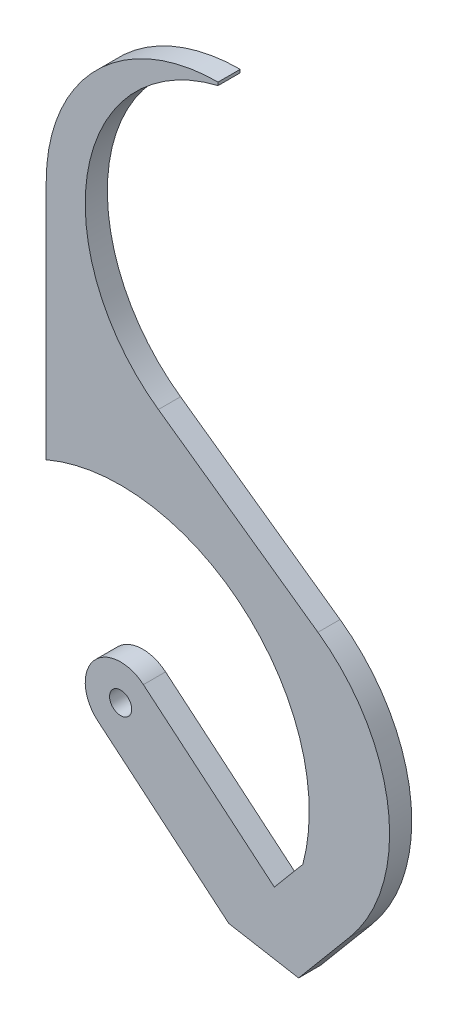
ISO-10303-21;
HEADER;
FILE_DESCRIPTION(('STEP AP214'),'2;1');
FILE_NAME('part.step','',(''),(''),'','','');
FILE_SCHEMA(('AUTOMOTIVE_DESIGN { 1 0 10303 214 1 1 1 1 }'));
ENDSEC;
DATA;
#1=APPLICATION_CONTEXT('core data for automotive mechanical design processes');
#2=APPLICATION_PROTOCOL_DEFINITION('international standard','automotive_design',2000,#1);
#3=PRODUCT_CONTEXT('',#1,'mechanical');
#4=PRODUCT('Part','Part','',(#3));
#5=PRODUCT_RELATED_PRODUCT_CATEGORY('part','',(#4));
#6=PRODUCT_DEFINITION_FORMATION('','',#4);
#7=PRODUCT_DEFINITION_CONTEXT('part definition',#1,'design');
#8=PRODUCT_DEFINITION('design','',#6,#7);
#9=PRODUCT_DEFINITION_SHAPE('','',#8);
#10=(LENGTH_UNIT() NAMED_UNIT(*) SI_UNIT(.MILLI.,.METRE.));
#11=(NAMED_UNIT(*) PLANE_ANGLE_UNIT() SI_UNIT($,.RADIAN.));
#12=(NAMED_UNIT(*) SI_UNIT($,.STERADIAN.) SOLID_ANGLE_UNIT());
#13=UNCERTAINTY_MEASURE_WITH_UNIT(LENGTH_MEASURE(1.E-05),#10,'distance_accuracy_value','');
#14=(GEOMETRIC_REPRESENTATION_CONTEXT(3) GLOBAL_UNCERTAINTY_ASSIGNED_CONTEXT((#13)) GLOBAL_UNIT_ASSIGNED_CONTEXT((#10,
#11,#12)) REPRESENTATION_CONTEXT('',''));
#15=CARTESIAN_POINT('',(0.,0.,0.));
#16=DIRECTION('',(0.,0.,1.));
#17=DIRECTION('',(1.,0.,0.));
#18=AXIS2_PLACEMENT_3D('',#15,#16,#17);
#19=CARTESIAN_POINT('',(-83.82,-84.8367141014244,-454.025));
#20=DIRECTION('',(0.,0.,1.));
#21=DIRECTION('',(1.,0.,0.));
#22=AXIS2_PLACEMENT_3D('',#19,#20,#21);
#23=CYLINDRICAL_SURFACE('',#22,5.07999999999999);
#24=CARTESIAN_POINT('',(-83.82,-84.8367141014244,-450.85));
#25=DIRECTION('',(0.,0.,1.));
#26=DIRECTION('',(1.,0.,0.));
#27=AXIS2_PLACEMENT_3D('',#24,#25,#26);
#28=CIRCLE('',#27,5.07999999999999);
#29=CARTESIAN_POINT('',(-80.5546389427924,-80.94520833038,-450.85));
#30=VERTEX_POINT('',#29);
#31=CARTESIAN_POINT('',(-87.0853610572076,-88.7282198724688,-450.85));
#32=VERTEX_POINT('',#31);
#33=EDGE_CURVE('E159',#30,#32,#28,.T.);
#34=ORIENTED_EDGE('',*,*,#33,.F.);
#35=DIRECTION('',(0.,0.,1.));
#36=VECTOR('',#35,1.);
#37=CARTESIAN_POINT('',(-80.5546389427924,-80.94520833038,-454.025));
#38=LINE('',#37,#36);
#39=CARTESIAN_POINT('',(-80.5546389427924,-80.94520833038,-454.025));
#40=VERTEX_POINT('',#39);
#41=EDGE_CURVE('E11',#40,#30,#38,.T.);
#42=ORIENTED_EDGE('',*,*,#41,.F.);
#43=CARTESIAN_POINT('',(-83.82,-84.8367141014244,-454.025));
#44=DIRECTION('',(0.,0.,1.));
#45=DIRECTION('',(1.,0.,0.));
#46=AXIS2_PLACEMENT_3D('',#43,#44,#45);
#47=CIRCLE('',#46,5.07999999999999);
#48=CARTESIAN_POINT('',(-87.0853610572076,-88.7282198724688,-454.025));
#49=VERTEX_POINT('',#48);
#50=EDGE_CURVE('E195',#40,#49,#47,.T.);
#51=ORIENTED_EDGE('',*,*,#50,.T.);
#52=DIRECTION('',(0.,0.,1.));
#53=VECTOR('',#52,1.);
#54=CARTESIAN_POINT('',(-87.0853610572076,-88.7282198724688,-454.025));
#55=LINE('',#54,#53);
#56=EDGE_CURVE('E35',#49,#32,#55,.T.);
#57=ORIENTED_EDGE('',*,*,#56,.T.);
#58=EDGE_LOOP('',(#34,#42,#51,#57));
#59=FACE_BOUND('',#58,.T.);
#60=ADVANCED_FACE('F32',(#59),#23,.T.);
#61=CARTESIAN_POINT('',(-61.777576564075,-96.7010344469544,-454.025));
#62=DIRECTION('',(0.642787609686537,0.76604444311898,0.));
#63=DIRECTION('',(-0.76604444311898,0.642787609686537,0.));
#64=AXIS2_PLACEMENT_3D('',#61,#62,#63);
#65=PLANE('',#64);
#66=DIRECTION('',(-0.76604444311898,0.642787609686537,0.));
#67=VECTOR('',#66,1.);
#68=CARTESIAN_POINT('',(-61.777576564075,-96.7010344469544,-450.85));
#69=LINE('',#68,#67);
#70=CARTESIAN_POINT('',(-61.777576564075,-96.7010344469544,-450.85));
#71=VERTEX_POINT('',#70);
#72=EDGE_CURVE('E193',#71,#30,#69,.T.);
#73=ORIENTED_EDGE('',*,*,#72,.F.);
#74=DIRECTION('',(0.,0.,1.));
#75=VECTOR('',#74,1.);
#76=CARTESIAN_POINT('',(-61.777576564075,-96.7010344469544,-454.025));
#77=LINE('',#76,#75);
#78=CARTESIAN_POINT('',(-61.777576564075,-96.7010344469544,-454.025));
#79=VERTEX_POINT('',#78);
#80=EDGE_CURVE('E41',#79,#71,#77,.T.);
#81=ORIENTED_EDGE('',*,*,#80,.F.);
#82=DIRECTION('',(-0.76604444311898,0.642787609686537,0.));
#83=VECTOR('',#82,1.);
#84=CARTESIAN_POINT('',(-61.777576564075,-96.7010344469544,-454.025));
#85=LINE('',#84,#83);
#86=EDGE_CURVE('E149',#79,#40,#85,.T.);
#87=ORIENTED_EDGE('',*,*,#86,.T.);
#88=ORIENTED_EDGE('',*,*,#41,.T.);
#89=EDGE_LOOP('',(#73,#81,#87,#88));
#90=FACE_BOUND('',#89,.T.);
#91=ADVANCED_FACE('F217',(#90),#65,.T.);
#92=CARTESIAN_POINT('',(-61.777576564075,-96.7010344469544,-454.025));
#93=DIRECTION('',(-0.76604444311898,0.642787609686537,0.));
#94=DIRECTION('',(-0.642787609686537,-0.76604444311898,0.));
#95=AXIS2_PLACEMENT_3D('',#92,#93,#94);
#96=PLANE('',#95);
#97=DIRECTION('',(-0.642787609686537,-0.76604444311898,0.));
#98=VECTOR('',#97,1.);
#99=CARTESIAN_POINT('',(-61.777576564075,-96.7010344469544,-450.85));
#100=LINE('',#99,#98);
#101=CARTESIAN_POINT('',(-57.6958752425654,-91.8366522331489,-450.85));
#102=VERTEX_POINT('',#101);
#103=EDGE_CURVE('E136',#102,#71,#100,.T.);
#104=ORIENTED_EDGE('',*,*,#103,.F.);
#105=DIRECTION('',(0.,0.,1.));
#106=VECTOR('',#105,1.);
#107=CARTESIAN_POINT('',(-57.6958752425654,-91.8366522331489,-454.025));
#108=LINE('',#107,#106);
#109=CARTESIAN_POINT('',(-57.6958752425654,-91.8366522331489,-454.025));
#110=VERTEX_POINT('',#109);
#111=EDGE_CURVE('E131',#110,#102,#108,.T.);
#112=ORIENTED_EDGE('',*,*,#111,.F.);
#113=DIRECTION('',(-0.642787609686537,-0.76604444311898,0.));
#114=VECTOR('',#113,1.);
#115=CARTESIAN_POINT('',(-61.777576564075,-96.7010344469544,-454.025));
#116=LINE('',#115,#114);
#117=EDGE_CURVE('E134',#110,#79,#116,.T.);
#118=ORIENTED_EDGE('',*,*,#117,.T.);
#119=ORIENTED_EDGE('',*,*,#80,.T.);
#120=EDGE_LOOP('',(#104,#112,#118,#119));
#121=FACE_BOUND('',#120,.T.);
#122=ADVANCED_FACE('F133',(#121),#96,.T.);
#123=CARTESIAN_POINT('',(-83.82,-84.8367141014244,-454.025));
#124=DIRECTION('',(0.,0.,1.));
#125=DIRECTION('',(1.,0.,0.));
#126=AXIS2_PLACEMENT_3D('',#123,#124,#125);
#127=CYLINDRICAL_SURFACE('',#126,27.0456840954333);
#128=CARTESIAN_POINT('',(-83.82,-84.8367141014244,-450.85));
#129=DIRECTION('',(0.,0.,-1.));
#130=DIRECTION('',(1.,0.,0.));
#131=AXIS2_PLACEMENT_3D('',#128,#129,#130);
#132=CIRCLE('',#131,27.0456840954333);
#133=CARTESIAN_POINT('',(-94.4880000000001,-59.9838912398263,-450.85));
#134=VERTEX_POINT('',#133);
#135=EDGE_CURVE('E190',#134,#102,#132,.T.);
#136=ORIENTED_EDGE('',*,*,#135,.F.);
#137=DIRECTION('',(0.,0.,1.));
#138=VECTOR('',#137,1.);
#139=CARTESIAN_POINT('',(-94.4880000000001,-59.9838912398263,-454.025));
#140=LINE('',#139,#138);
#141=CARTESIAN_POINT('',(-94.4880000000001,-59.9838912398263,-454.025));
#142=VERTEX_POINT('',#141);
#143=EDGE_CURVE('E141',#142,#134,#140,.T.);
#144=ORIENTED_EDGE('',*,*,#143,.F.);
#145=CARTESIAN_POINT('',(-83.82,-84.8367141014244,-454.025));
#146=DIRECTION('',(0.,0.,-1.));
#147=DIRECTION('',(1.,0.,0.));
#148=AXIS2_PLACEMENT_3D('',#145,#146,#147);
#149=CIRCLE('',#148,27.0456840954333);
#150=EDGE_CURVE('E147',#142,#110,#149,.T.);
#151=ORIENTED_EDGE('',*,*,#150,.T.);
#152=ORIENTED_EDGE('',*,*,#111,.T.);
#153=EDGE_LOOP('',(#136,#144,#151,#152));
#154=FACE_BOUND('',#153,.T.);
#155=ADVANCED_FACE('F151',(#154),#127,.F.);
#156=CARTESIAN_POINT('',(-94.488,-25.4,-454.025));
#157=DIRECTION('',(-1.,0.,0.));
#158=DIRECTION('',(0.,-1.,0.));
#159=AXIS2_PLACEMENT_3D('',#156,#157,#158);
#160=PLANE('',#159);
#161=DIRECTION('',(0.,-1.,0.));
#162=VECTOR('',#161,1.);
#163=CARTESIAN_POINT('',(-94.488,-25.4,-450.85));
#164=LINE('',#163,#162);
#165=CARTESIAN_POINT('',(-94.488,-25.4,-450.85));
#166=VERTEX_POINT('',#165);
#167=EDGE_CURVE('E187',#166,#134,#164,.T.);
#168=ORIENTED_EDGE('',*,*,#167,.F.);
#169=DIRECTION('',(0.,0.,1.));
#170=VECTOR('',#169,1.);
#171=CARTESIAN_POINT('',(-94.488,-25.4,-454.025));
#172=LINE('',#171,#170);
#173=CARTESIAN_POINT('',(-94.488,-25.4,-454.025));
#174=VERTEX_POINT('',#173);
#175=EDGE_CURVE('E199',#174,#166,#172,.T.);
#176=ORIENTED_EDGE('',*,*,#175,.F.);
#177=DIRECTION('',(0.,-1.,0.));
#178=VECTOR('',#177,1.);
#179=CARTESIAN_POINT('',(-94.488,-25.4,-454.025));
#180=LINE('',#179,#178);
#181=EDGE_CURVE('E152',#174,#142,#180,.T.);
#182=ORIENTED_EDGE('',*,*,#181,.T.);
#183=ORIENTED_EDGE('',*,*,#143,.T.);
#184=EDGE_LOOP('',(#168,#176,#182,#183));
#185=FACE_BOUND('',#184,.T.);
#186=ADVANCED_FACE('F230',(#185),#160,.T.);
#187=CARTESIAN_POINT('',(-69.85,-25.4,-454.025));
#188=DIRECTION('',(0.,0.,1.));
#189=DIRECTION('',(1.,0.,0.));
#190=AXIS2_PLACEMENT_3D('',#187,#188,#189);
#191=CYLINDRICAL_SURFACE('',#190,24.638);
#192=CARTESIAN_POINT('',(-69.85,-25.4,-450.85));
#193=DIRECTION('',(0.,0.,1.));
#194=DIRECTION('',(1.,0.,0.));
#195=AXIS2_PLACEMENT_3D('',#192,#193,#194);
#196=CIRCLE('',#195,24.638);
#197=CARTESIAN_POINT('',(-69.85,-0.761999999999992,-450.85));
#198=VERTEX_POINT('',#197);
#199=EDGE_CURVE('E184',#198,#166,#196,.T.);
#200=ORIENTED_EDGE('',*,*,#199,.F.);
#201=DIRECTION('',(0.,0.,1.));
#202=VECTOR('',#201,1.);
#203=CARTESIAN_POINT('',(-69.85,-0.761999999999992,-454.025));
#204=LINE('',#203,#202);
#205=CARTESIAN_POINT('',(-69.85,-0.761999999999992,-454.025));
#206=VERTEX_POINT('',#205);
#207=EDGE_CURVE('E201',#206,#198,#204,.T.);
#208=ORIENTED_EDGE('',*,*,#207,.F.);
#209=CARTESIAN_POINT('',(-69.85,-25.4,-454.025));
#210=DIRECTION('',(0.,0.,1.));
#211=DIRECTION('',(1.,0.,0.));
#212=AXIS2_PLACEMENT_3D('',#209,#210,#211);
#213=CIRCLE('',#212,24.638);
#214=EDGE_CURVE('E154',#206,#174,#213,.T.);
#215=ORIENTED_EDGE('',*,*,#214,.T.);
#216=ORIENTED_EDGE('',*,*,#175,.T.);
#217=EDGE_LOOP('',(#200,#208,#215,#216));
#218=FACE_BOUND('',#217,.T.);
#219=ADVANCED_FACE('F233',(#218),#191,.T.);
#220=CARTESIAN_POINT('',(-69.85,-0.761999999999992,-454.025));
#221=DIRECTION('',(1.,0.,0.));
#222=DIRECTION('',(0.,0.,-1.));
#223=AXIS2_PLACEMENT_3D('',#220,#221,#222);
#224=PLANE('',#223);
#225=DIRECTION('',(0.,1.,0.));
#226=VECTOR('',#225,1.);
#227=CARTESIAN_POINT('',(-69.85,-0.761999999999992,-450.85));
#228=LINE('',#227,#226);
#229=CARTESIAN_POINT('',(-69.85,-1.20325021826278,-450.85));
#230=VERTEX_POINT('',#229);
#231=EDGE_CURVE('E181',#230,#198,#228,.T.);
#232=ORIENTED_EDGE('',*,*,#231,.F.);
#233=DIRECTION('',(0.,0.,1.));
#234=VECTOR('',#233,1.);
#235=CARTESIAN_POINT('',(-69.85,-1.20325021826278,-454.025));
#236=LINE('',#235,#234);
#237=CARTESIAN_POINT('',(-69.85,-1.20325021826278,-454.025));
#238=VERTEX_POINT('',#237);
#239=EDGE_CURVE('E203',#238,#230,#236,.T.);
#240=ORIENTED_EDGE('',*,*,#239,.F.);
#241=DIRECTION('',(0.,1.,0.));
#242=VECTOR('',#241,1.);
#243=CARTESIAN_POINT('',(-69.85,-0.761999999999992,-454.025));
#244=LINE('',#243,#242);
#245=EDGE_CURVE('E303',#238,#206,#244,.T.);
#246=ORIENTED_EDGE('',*,*,#245,.T.);
#247=ORIENTED_EDGE('',*,*,#207,.T.);
#248=EDGE_LOOP('',(#232,#240,#246,#247));
#249=FACE_BOUND('',#248,.T.);
#250=ADVANCED_FACE('F237',(#249),#224,.T.);
#251=CARTESIAN_POINT('',(-64.008,-25.4,-454.025));
#252=DIRECTION('',(0.,0.,1.));
#253=DIRECTION('',(1.,0.,0.));
#254=AXIS2_PLACEMENT_3D('',#251,#252,#253);
#255=CYLINDRICAL_SURFACE('',#254,24.892);
#256=CARTESIAN_POINT('',(-64.008,-25.4,-450.85));
#257=DIRECTION('',(0.,0.,-1.));
#258=DIRECTION('',(1.,0.,0.));
#259=AXIS2_PLACEMENT_3D('',#256,#257,#258);
#260=CIRCLE('',#259,24.892);
#261=CARTESIAN_POINT('',(-78.4071863115042,-45.7045585415342,-450.85));
#262=VERTEX_POINT('',#261);
#263=EDGE_CURVE('E178',#262,#230,#260,.T.);
#264=ORIENTED_EDGE('',*,*,#263,.F.);
#265=DIRECTION('',(0.,0.,1.));
#266=VECTOR('',#265,1.);
#267=CARTESIAN_POINT('',(-78.4071863115042,-45.7045585415342,-454.025));
#268=LINE('',#267,#266);
#269=CARTESIAN_POINT('',(-78.4071863115042,-45.7045585415342,-454.025));
#270=VERTEX_POINT('',#269);
#271=EDGE_CURVE('E205',#270,#262,#268,.T.);
#272=ORIENTED_EDGE('',*,*,#271,.F.);
#273=CARTESIAN_POINT('',(-64.008,-25.4,-454.025));
#274=DIRECTION('',(0.,0.,-1.));
#275=DIRECTION('',(1.,0.,0.));
#276=AXIS2_PLACEMENT_3D('',#273,#274,#275);
#277=CIRCLE('',#276,24.892);
#278=EDGE_CURVE('E300',#270,#238,#277,.T.);
#279=ORIENTED_EDGE('',*,*,#278,.T.);
#280=ORIENTED_EDGE('',*,*,#239,.T.);
#281=EDGE_LOOP('',(#264,#272,#279,#280));
#282=FACE_BOUND('',#281,.T.);
#283=ADVANCED_FACE('F241',(#282),#255,.F.);
#284=CARTESIAN_POINT('',(-78.4071863115042,-45.7045585415342,-454.025));
#285=DIRECTION('',(0.578466427426649,0.815706192412592,0.));
#286=DIRECTION('',(-0.815706192412592,0.578466427426649,0.));
#287=AXIS2_PLACEMENT_3D('',#284,#285,#286);
#288=PLANE('',#287);
#289=DIRECTION('',(-0.815706192412592,0.578466427426649,0.));
#290=VECTOR('',#289,1.);
#291=CARTESIAN_POINT('',(-78.4071863115042,-45.7045585415342,-450.85));
#292=LINE('',#291,#290);
#293=CARTESIAN_POINT('',(-55.5294918638108,-61.9285106189041,-450.85));
#294=VERTEX_POINT('',#293);
#295=EDGE_CURVE('E175',#294,#262,#292,.T.);
#296=ORIENTED_EDGE('',*,*,#295,.F.);
#297=DIRECTION('',(0.,0.,1.));
#298=VECTOR('',#297,1.);
#299=CARTESIAN_POINT('',(-55.5294918638108,-61.9285106189041,-454.025));
#300=LINE('',#299,#298);
#301=CARTESIAN_POINT('',(-55.5294918638108,-61.9285106189041,-454.025));
#302=VERTEX_POINT('',#301);
#303=EDGE_CURVE('E207',#302,#294,#300,.T.);
#304=ORIENTED_EDGE('',*,*,#303,.F.);
#305=DIRECTION('',(-0.815706192412592,0.578466427426649,0.));
#306=VECTOR('',#305,1.);
#307=CARTESIAN_POINT('',(-78.4071863115042,-45.7045585415342,-454.025));
#308=LINE('',#307,#306);
#309=EDGE_CURVE('E297',#302,#270,#308,.T.);
#310=ORIENTED_EDGE('',*,*,#309,.T.);
#311=ORIENTED_EDGE('',*,*,#271,.T.);
#312=EDGE_LOOP('',(#296,#304,#310,#311));
#313=FACE_BOUND('',#312,.T.);
#314=ADVANCED_FACE('F245',(#313),#288,.T.);
#315=CARTESIAN_POINT('',(-69.6348172301822,-81.8186904146927,-454.025));
#316=DIRECTION('',(0.,0.,1.));
#317=DIRECTION('',(1.,0.,0.));
#318=AXIS2_PLACEMENT_3D('',#315,#316,#317);
#319=CYLINDRICAL_SURFACE('',#318,24.384);
#320=CARTESIAN_POINT('',(-69.6348172301822,-81.8186904146927,-450.85));
#321=DIRECTION('',(0.,0.,1.));
#322=DIRECTION('',(1.,0.,0.));
#323=AXIS2_PLACEMENT_3D('',#320,#321,#322);
#324=CIRCLE('',#323,24.384);
#325=CARTESIAN_POINT('',(-50.955589529169,-97.4924234892892,-450.85));
#326=VERTEX_POINT('',#325);
#327=EDGE_CURVE('E172',#326,#294,#324,.T.);
#328=ORIENTED_EDGE('',*,*,#327,.F.);
#329=DIRECTION('',(0.,0.,1.));
#330=VECTOR('',#329,1.);
#331=CARTESIAN_POINT('',(-50.955589529169,-97.4924234892892,-454.025));
#332=LINE('',#331,#330);
#333=CARTESIAN_POINT('',(-50.955589529169,-97.4924234892892,-454.025));
#334=VERTEX_POINT('',#333);
#335=EDGE_CURVE('E209',#334,#326,#332,.T.);
#336=ORIENTED_EDGE('',*,*,#335,.F.);
#337=CARTESIAN_POINT('',(-69.6348172301822,-81.8186904146927,-454.025));
#338=DIRECTION('',(0.,0.,1.));
#339=DIRECTION('',(1.,0.,0.));
#340=AXIS2_PLACEMENT_3D('',#337,#338,#339);
#341=CIRCLE('',#340,24.384);
#342=EDGE_CURVE('E294',#334,#302,#341,.T.);
#343=ORIENTED_EDGE('',*,*,#342,.T.);
#344=ORIENTED_EDGE('',*,*,#303,.T.);
#345=EDGE_LOOP('',(#328,#336,#343,#344));
#346=FACE_BOUND('',#345,.T.);
#347=ADVANCED_FACE('F249',(#346),#319,.T.);
#348=CARTESIAN_POINT('',(-58.3026519078861,-106.248311474139,-454.025));
#349=DIRECTION('',(0.76604444311898,-0.642787609686537,0.));
#350=DIRECTION('',(0.642787609686537,0.76604444311898,0.));
#351=AXIS2_PLACEMENT_3D('',#348,#349,#350);
#352=PLANE('',#351);
#353=DIRECTION('',(0.642787609686537,0.76604444311898,0.));
#354=VECTOR('',#353,1.);
#355=CARTESIAN_POINT('',(-58.3026519078861,-106.248311474139,-450.85));
#356=LINE('',#355,#354);
#357=CARTESIAN_POINT('',(-58.3026519078861,-106.248311474139,-450.85));
#358=VERTEX_POINT('',#357);
#359=EDGE_CURVE('E169',#358,#326,#356,.T.);
#360=ORIENTED_EDGE('',*,*,#359,.F.);
#361=DIRECTION('',(0.,0.,1.));
#362=VECTOR('',#361,1.);
#363=CARTESIAN_POINT('',(-58.3026519078861,-106.248311474139,-454.025));
#364=LINE('',#363,#362);
#365=CARTESIAN_POINT('',(-58.3026519078861,-106.248311474139,-454.025));
#366=VERTEX_POINT('',#365);
#367=EDGE_CURVE('E211',#366,#358,#364,.T.);
#368=ORIENTED_EDGE('',*,*,#367,.F.);
#369=DIRECTION('',(0.642787609686537,0.76604444311898,0.));
#370=VECTOR('',#369,1.);
#371=CARTESIAN_POINT('',(-58.3026519078861,-106.248311474139,-454.025));
#372=LINE('',#371,#370);
#373=EDGE_CURVE('E291',#366,#334,#372,.T.);
#374=ORIENTED_EDGE('',*,*,#373,.T.);
#375=ORIENTED_EDGE('',*,*,#335,.T.);
#376=EDGE_LOOP('',(#360,#368,#374,#375));
#377=FACE_BOUND('',#376,.T.);
#378=ADVANCED_FACE('F253',(#377),#352,.T.);
#379=CARTESIAN_POINT('',(-68.3082986784902,-104.484045989043,-454.025));
#380=DIRECTION('',(-0.173648177666923,-0.984807753012209,0.));
#381=DIRECTION('',(0.984807753012209,-0.173648177666923,0.));
#382=AXIS2_PLACEMENT_3D('',#379,#380,#381);
#383=PLANE('',#382);
#384=DIRECTION('',(0.984807753012209,-0.173648177666923,0.));
#385=VECTOR('',#384,1.);
#386=CARTESIAN_POINT('',(-68.3082986784902,-104.484045989043,-450.85));
#387=LINE('',#386,#385);
#388=CARTESIAN_POINT('',(-68.3082986784902,-104.484045989043,-450.85));
#389=VERTEX_POINT('',#388);
#390=EDGE_CURVE('E166',#389,#358,#387,.T.);
#391=ORIENTED_EDGE('',*,*,#390,.F.);
#392=DIRECTION('',(0.,0.,1.));
#393=VECTOR('',#392,1.);
#394=CARTESIAN_POINT('',(-68.3082986784902,-104.484045989043,-454.025));
#395=LINE('',#394,#393);
#396=CARTESIAN_POINT('',(-68.3082986784902,-104.484045989043,-454.025));
#397=VERTEX_POINT('',#396);
#398=EDGE_CURVE('E212',#397,#389,#395,.T.);
#399=ORIENTED_EDGE('',*,*,#398,.F.);
#400=DIRECTION('',(0.984807753012209,-0.173648177666923,0.));
#401=VECTOR('',#400,1.);
#402=CARTESIAN_POINT('',(-68.3082986784902,-104.484045989043,-454.025));
#403=LINE('',#402,#401);
#404=EDGE_CURVE('E288',#397,#366,#403,.T.);
#405=ORIENTED_EDGE('',*,*,#404,.T.);
#406=ORIENTED_EDGE('',*,*,#367,.T.);
#407=EDGE_LOOP('',(#391,#399,#405,#406));
#408=FACE_BOUND('',#407,.T.);
#409=ADVANCED_FACE('F257',(#408),#383,.T.);
#410=CARTESIAN_POINT('',(-87.0853610572076,-88.7282198724688,-454.025));
#411=DIRECTION('',(-0.642787609686537,-0.766044443118979,0.));
#412=DIRECTION('',(0.76604444311898,-0.642787609686538,0.));
#413=AXIS2_PLACEMENT_3D('',#410,#411,#412);
#414=PLANE('',#413);
#415=DIRECTION('',(0.76604444311898,-0.642787609686537,0.));
#416=VECTOR('',#415,1.);
#417=CARTESIAN_POINT('',(-87.0853610572076,-88.7282198724688,-450.85));
#418=LINE('',#417,#416);
#419=EDGE_CURVE('E162',#32,#389,#418,.T.);
#420=ORIENTED_EDGE('',*,*,#419,.F.);
#421=ORIENTED_EDGE('',*,*,#56,.F.);
#422=DIRECTION('',(0.76604444311898,-0.642787609686537,0.));
#423=VECTOR('',#422,1.);
#424=CARTESIAN_POINT('',(-87.0853610572076,-88.7282198724688,-454.025));
#425=LINE('',#424,#423);
#426=EDGE_CURVE('E286',#49,#397,#425,.T.);
#427=ORIENTED_EDGE('',*,*,#426,.T.);
#428=ORIENTED_EDGE('',*,*,#398,.T.);
#429=EDGE_LOOP('',(#420,#421,#427,#428));
#430=FACE_BOUND('',#429,.T.);
#431=ADVANCED_FACE('F214',(#430),#414,.T.);
#432=CARTESIAN_POINT('',(-83.82,-84.8367141014244,-454.025));
#433=DIRECTION('',(0.,0.,1.));
#434=DIRECTION('',(1.,0.,0.));
#435=AXIS2_PLACEMENT_3D('',#432,#433,#434);
#436=PLANE('',#435);
#437=CARTESIAN_POINT('',(-83.82,-84.8367141014244,-454.025));
#438=DIRECTION('',(0.,0.,1.));
#439=DIRECTION('',(1.,0.,0.));
#440=AXIS2_PLACEMENT_3D('',#437,#438,#439);
#441=CIRCLE('',#440,1.58749999999999);
#442=CARTESIAN_POINT('',(-82.2325,-84.8367141014244,-454.025));
#443=VERTEX_POINT('',#442);
#444=EDGE_CURVE('E163',#443,#443,#441,.T.);
#445=ORIENTED_EDGE('',*,*,#444,.T.);
#446=EDGE_LOOP('',(#445));
#447=FACE_BOUND('',#446,.T.);
#448=ORIENTED_EDGE('',*,*,#50,.F.);
#449=ORIENTED_EDGE('',*,*,#86,.F.);
#450=ORIENTED_EDGE('',*,*,#117,.F.);
#451=ORIENTED_EDGE('',*,*,#150,.F.);
#452=ORIENTED_EDGE('',*,*,#181,.F.);
#453=ORIENTED_EDGE('',*,*,#214,.F.);
#454=ORIENTED_EDGE('',*,*,#245,.F.);
#455=ORIENTED_EDGE('',*,*,#278,.F.);
#456=ORIENTED_EDGE('',*,*,#309,.F.);
#457=ORIENTED_EDGE('',*,*,#342,.F.);
#458=ORIENTED_EDGE('',*,*,#373,.F.);
#459=ORIENTED_EDGE('',*,*,#404,.F.);
#460=ORIENTED_EDGE('',*,*,#426,.F.);
#461=EDGE_LOOP('',(#448,#449,#450,#451,#452,#453,#454,#455,#456,#457,#458,#459,#460));
#462=FACE_BOUND('',#461,.T.);
#463=ADVANCED_FACE('F145',(#447,#462),#436,.F.);
#464=CARTESIAN_POINT('',(-83.82,-84.8367141014244,-450.85));
#465=DIRECTION('',(0.,0.,1.));
#466=DIRECTION('',(1.,0.,0.));
#467=AXIS2_PLACEMENT_3D('',#464,#465,#466);
#468=PLANE('',#467);
#469=CARTESIAN_POINT('',(-83.82,-84.8367141014244,-450.85));
#470=DIRECTION('',(0.,0.,1.));
#471=DIRECTION('',(1.,0.,0.));
#472=AXIS2_PLACEMENT_3D('',#469,#470,#471);
#473=CIRCLE('',#472,1.58749999999999);
#474=CARTESIAN_POINT('',(-82.2325,-84.8367141014244,-450.85));
#475=VERTEX_POINT('',#474);
#476=EDGE_CURVE('E281',#475,#475,#473,.T.);
#477=ORIENTED_EDGE('',*,*,#476,.F.);
#478=EDGE_LOOP('',(#477));
#479=FACE_BOUND('',#478,.T.);
#480=ORIENTED_EDGE('',*,*,#33,.T.);
#481=ORIENTED_EDGE('',*,*,#419,.T.);
#482=ORIENTED_EDGE('',*,*,#390,.T.);
#483=ORIENTED_EDGE('',*,*,#359,.T.);
#484=ORIENTED_EDGE('',*,*,#327,.T.);
#485=ORIENTED_EDGE('',*,*,#295,.T.);
#486=ORIENTED_EDGE('',*,*,#263,.T.);
#487=ORIENTED_EDGE('',*,*,#231,.T.);
#488=ORIENTED_EDGE('',*,*,#199,.T.);
#489=ORIENTED_EDGE('',*,*,#167,.T.);
#490=ORIENTED_EDGE('',*,*,#135,.T.);
#491=ORIENTED_EDGE('',*,*,#103,.T.);
#492=ORIENTED_EDGE('',*,*,#72,.T.);
#493=EDGE_LOOP('',(#480,#481,#482,#483,#484,#485,#486,#487,#488,#489,#490,#491,#492));
#494=FACE_BOUND('',#493,.T.);
#495=ADVANCED_FACE('F216',(#479,#494),#468,.T.);
#496=CARTESIAN_POINT('',(-83.82,-84.8367141014244,-454.025));
#497=DIRECTION('',(0.,0.,1.));
#498=DIRECTION('',(1.,0.,0.));
#499=AXIS2_PLACEMENT_3D('',#496,#497,#498);
#500=CYLINDRICAL_SURFACE('',#499,1.58749999999999);
#501=ORIENTED_EDGE('',*,*,#444,.F.);
#502=EDGE_LOOP('',(#501));
#503=FACE_BOUND('',#502,.T.);
#504=ORIENTED_EDGE('',*,*,#476,.T.);
#505=EDGE_LOOP('',(#504));
#506=FACE_BOUND('',#505,.T.);
#507=ADVANCED_FACE('F269',(#503,#506),#500,.F.);
#508=CLOSED_SHELL('',(#60,#91,#122,#155,#186,#219,#250,#283,#314,#347,#378,#409,#431,#463,#495,#507));
#509=MANIFOLD_SOLID_BREP('B2',#508);
#510=ADVANCED_BREP_SHAPE_REPRESENTATION('',(#18,#509),#14);
#511=SHAPE_DEFINITION_REPRESENTATION(#9,#510);
ENDSEC;
END-ISO-10303-21;
